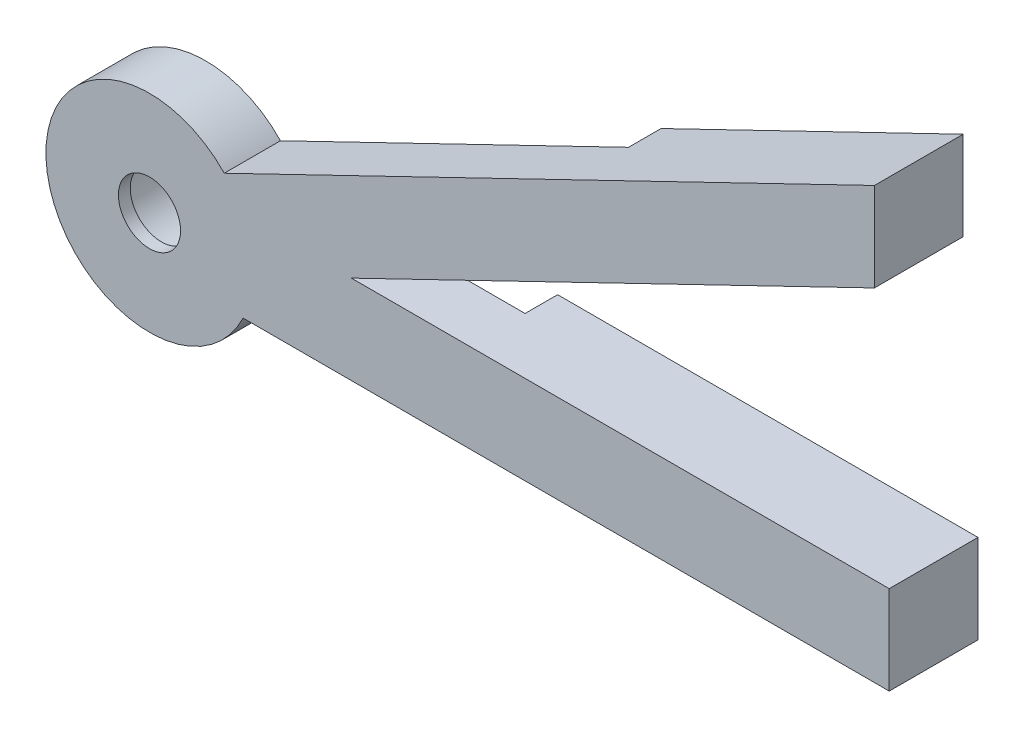
ISO-10303-21;
HEADER;
FILE_DESCRIPTION(('STEP AP214'),'2;1');
FILE_NAME('part.step','',(''),(''),'','','');
FILE_SCHEMA(('AUTOMOTIVE_DESIGN { 1 0 10303 214 1 1 1 1 }'));
ENDSEC;
DATA;
#1=APPLICATION_CONTEXT('core data for automotive mechanical design processes');
#2=APPLICATION_PROTOCOL_DEFINITION('international standard','automotive_design',2000,#1);
#3=PRODUCT_CONTEXT('',#1,'mechanical');
#4=PRODUCT('Part','Part','',(#3));
#5=PRODUCT_RELATED_PRODUCT_CATEGORY('part','',(#4));
#6=PRODUCT_DEFINITION_FORMATION('','',#4);
#7=PRODUCT_DEFINITION_CONTEXT('part definition',#1,'design');
#8=PRODUCT_DEFINITION('design','',#6,#7);
#9=PRODUCT_DEFINITION_SHAPE('','',#8);
#10=(LENGTH_UNIT() NAMED_UNIT(*) SI_UNIT(.MILLI.,.METRE.));
#11=(NAMED_UNIT(*) PLANE_ANGLE_UNIT() SI_UNIT($,.RADIAN.));
#12=(NAMED_UNIT(*) SI_UNIT($,.STERADIAN.) SOLID_ANGLE_UNIT());
#13=UNCERTAINTY_MEASURE_WITH_UNIT(LENGTH_MEASURE(1.E-05),#10,'distance_accuracy_value','');
#14=(GEOMETRIC_REPRESENTATION_CONTEXT(3) GLOBAL_UNCERTAINTY_ASSIGNED_CONTEXT((#13)) GLOBAL_UNIT_ASSIGNED_CONTEXT((#10,
#11,#12)) REPRESENTATION_CONTEXT('',''));
#15=CARTESIAN_POINT('',(0.,0.,0.));
#16=DIRECTION('',(0.,0.,1.));
#17=DIRECTION('',(1.,0.,0.));
#18=AXIS2_PLACEMENT_3D('',#15,#16,#17);
#19=CARTESIAN_POINT('',(-33.5242196667489,8.13237811094645,-3.8));
#20=DIRECTION('',(0.,0.,1.));
#21=DIRECTION('',(1.,0.,0.));
#22=AXIS2_PLACEMENT_3D('',#19,#20,#21);
#23=CYLINDRICAL_SURFACE('',#22,2.1);
#24=CARTESIAN_POINT('',(-33.5242196667489,8.13237811094645,0.));
#25=DIRECTION('',(0.,0.,1.));
#26=DIRECTION('',(1.,0.,0.));
#27=AXIS2_PLACEMENT_3D('',#24,#25,#26);
#28=CIRCLE('',#27,2.1);
#29=CARTESIAN_POINT('',(-31.4242196667489,8.13237811094645,0.));
#30=VERTEX_POINT('',#29);
#31=EDGE_CURVE('E227',#30,#30,#28,.T.);
#32=CARTESIAN_POINT('',(-33.5242196667489,8.13237811094645,-0.8));
#33=DIRECTION('',(0.,0.,-1.));
#34=DIRECTION('',(-1.,0.,0.));
#35=AXIS2_PLACEMENT_3D('',#32,#33,#34);
#36=CIRCLE('',#35,2.1);
#37=CARTESIAN_POINT('',(-31.4242196667489,8.13237811094645,-0.799999999999999));
#38=VERTEX_POINT('',#37);
#39=EDGE_CURVE('E44',#38,#38,#36,.F.);
#40=CARTESIAN_POINT('',(-31.4242196667489,8.13237811094645,0.));
#41=CARTESIAN_POINT('',(-31.4242196667489,8.13237811094645,-0.00833333333333328));
#42=CARTESIAN_POINT('',(-31.4242196667489,8.13237811094645,-0.0166666666666666));
#43=CARTESIAN_POINT('',(-31.4242196667489,8.13237811094645,-0.0333333333333333));
#44=CARTESIAN_POINT('',(-31.4242196667489,8.13237811094645,-0.0416666666666667));
#45=CARTESIAN_POINT('',(-31.4242196667489,8.13237811094645,-0.0583333333333334));
#46=CARTESIAN_POINT('',(-31.4242196667489,8.13237811094645,-0.0666666666666667));
#47=CARTESIAN_POINT('',(-31.4242196667489,8.13237811094645,-0.0833333333333333));
#48=CARTESIAN_POINT('',(-31.4242196667489,8.13237811094645,-0.0916666666666665));
#49=CARTESIAN_POINT('',(-31.4242196667489,8.13237811094645,-0.108333333333333));
#50=CARTESIAN_POINT('',(-31.4242196667489,8.13237811094645,-0.116666666666667));
#51=CARTESIAN_POINT('',(-31.4242196667489,8.13237811094645,-0.133333333333333));
#52=CARTESIAN_POINT('',(-31.4242196667489,8.13237811094645,-0.141666666666667));
#53=CARTESIAN_POINT('',(-31.4242196667489,8.13237811094645,-0.158333333333333));
#54=CARTESIAN_POINT('',(-31.4242196667489,8.13237811094645,-0.166666666666667));
#55=CARTESIAN_POINT('',(-31.4242196667489,8.13237811094645,-0.183333333333333));
#56=CARTESIAN_POINT('',(-31.4242196667489,8.13237811094645,-0.191666666666666));
#57=CARTESIAN_POINT('',(-31.4242196667489,8.13237811094645,-0.208333333333333));
#58=CARTESIAN_POINT('',(-31.4242196667489,8.13237811094645,-0.216666666666667));
#59=CARTESIAN_POINT('',(-31.4242196667489,8.13237811094645,-0.233333333333333));
#60=CARTESIAN_POINT('',(-31.4242196667489,8.13237811094645,-0.241666666666667));
#61=CARTESIAN_POINT('',(-31.4242196667489,8.13237811094645,-0.258333333333333));
#62=CARTESIAN_POINT('',(-31.4242196667489,8.13237811094645,-0.266666666666667));
#63=CARTESIAN_POINT('',(-31.4242196667489,8.13237811094645,-0.283333333333333));
#64=CARTESIAN_POINT('',(-31.4242196667489,8.13237811094645,-0.291666666666667));
#65=CARTESIAN_POINT('',(-31.4242196667489,8.13237811094645,-0.308333333333333));
#66=CARTESIAN_POINT('',(-31.4242196667489,8.13237811094645,-0.316666666666666));
#67=CARTESIAN_POINT('',(-31.4242196667489,8.13237811094645,-0.333333333333333));
#68=CARTESIAN_POINT('',(-31.4242196667489,8.13237811094645,-0.341666666666666));
#69=CARTESIAN_POINT('',(-31.4242196667489,8.13237811094645,-0.358333333333333));
#70=CARTESIAN_POINT('',(-31.4242196667489,8.13237811094645,-0.366666666666666));
#71=CARTESIAN_POINT('',(-31.4242196667489,8.13237811094645,-0.383333333333333));
#72=CARTESIAN_POINT('',(-31.4242196667489,8.13237811094645,-0.391666666666666));
#73=CARTESIAN_POINT('',(-31.4242196667489,8.13237811094645,-0.408333333333333));
#74=CARTESIAN_POINT('',(-31.4242196667489,8.13237811094645,-0.416666666666666));
#75=CARTESIAN_POINT('',(-31.4242196667489,8.13237811094645,-0.433333333333333));
#76=CARTESIAN_POINT('',(-31.4242196667489,8.13237811094645,-0.441666666666666));
#77=CARTESIAN_POINT('',(-31.4242196667489,8.13237811094645,-0.458333333333333));
#78=CARTESIAN_POINT('',(-31.4242196667489,8.13237811094645,-0.466666666666666));
#79=CARTESIAN_POINT('',(-31.4242196667489,8.13237811094645,-0.483333333333333));
#80=CARTESIAN_POINT('',(-31.4242196667489,8.13237811094645,-0.491666666666666));
#81=CARTESIAN_POINT('',(-31.4242196667489,8.13237811094645,-0.508333333333333));
#82=CARTESIAN_POINT('',(-31.4242196667489,8.13237811094645,-0.516666666666666));
#83=CARTESIAN_POINT('',(-31.4242196667489,8.13237811094645,-0.533333333333333));
#84=CARTESIAN_POINT('',(-31.4242196667489,8.13237811094645,-0.541666666666666));
#85=CARTESIAN_POINT('',(-31.4242196667489,8.13237811094645,-0.558333333333333));
#86=CARTESIAN_POINT('',(-31.4242196667489,8.13237811094645,-0.566666666666666));
#87=CARTESIAN_POINT('',(-31.4242196667489,8.13237811094645,-0.583333333333333));
#88=CARTESIAN_POINT('',(-31.4242196667489,8.13237811094645,-0.591666666666666));
#89=CARTESIAN_POINT('',(-31.4242196667489,8.13237811094645,-0.608333333333333));
#90=CARTESIAN_POINT('',(-31.4242196667489,8.13237811094645,-0.616666666666666));
#91=CARTESIAN_POINT('',(-31.4242196667489,8.13237811094645,-0.633333333333333));
#92=CARTESIAN_POINT('',(-31.4242196667489,8.13237811094645,-0.641666666666666));
#93=CARTESIAN_POINT('',(-31.4242196667489,8.13237811094645,-0.658333333333333));
#94=CARTESIAN_POINT('',(-31.4242196667489,8.13237811094645,-0.666666666666666));
#95=CARTESIAN_POINT('',(-31.4242196667489,8.13237811094645,-0.683333333333333));
#96=CARTESIAN_POINT('',(-31.4242196667489,8.13237811094645,-0.691666666666666));
#97=CARTESIAN_POINT('',(-31.4242196667489,8.13237811094645,-0.708333333333333));
#98=CARTESIAN_POINT('',(-31.4242196667489,8.13237811094645,-0.716666666666666));
#99=CARTESIAN_POINT('',(-31.4242196667489,8.13237811094645,-0.733333333333333));
#100=CARTESIAN_POINT('',(-31.4242196667489,8.13237811094645,-0.741666666666666));
#101=CARTESIAN_POINT('',(-31.4242196667489,8.13237811094645,-0.758333333333333));
#102=CARTESIAN_POINT('',(-31.4242196667489,8.13237811094645,-0.766666666666666));
#103=CARTESIAN_POINT('',(-31.4242196667489,8.13237811094645,-0.783333333333333));
#104=CARTESIAN_POINT('',(-31.4242196667489,8.13237811094645,-0.791666666666666));
#105=CARTESIAN_POINT('',(-31.4242196667489,8.13237811094645,-0.799999999999999));
#106=B_SPLINE_CURVE_WITH_KNOTS('',3,(#40,#41,#42,#43,#44,#45,#46,#47,#48,#49,#50,#51,#52,#53,
#54,#55,#56,#57,#58,#59,#60,#61,#62,#63,#64,#65,#66,#67,#68,#69,#70,#71,#72,#73,#74,#75,#76,#77,
#78,#79,#80,#81,#82,#83,#84,#85,#86,#87,#88,#89,#90,#91,#92,#93,#94,#95,#96,#97,#98,#99,#100,
#101,#102,#103,#104,#105),.UNSPECIFIED.,.F.,.F.,(4,2,2,2,2,2,2,2,2,2,2,2,2,2,2,2,2,2,2,2,2,2,2,
2,2,2,2,2,2,2,2,2,4),(0.,0.0249999999999998,0.0500000000000001,0.075,0.0999999999999998,0.125,
0.15,0.175,0.2,0.225,0.25,0.275,0.3,0.325,0.35,0.375,0.4,0.425,0.45,0.475,0.5,0.524999999999999,
0.55,0.575,0.6,0.625,0.65,0.674999999999999,0.7,0.725,0.75,0.775,0.799999999999999),.UNSPECIFIED.);
#107=EDGE_CURVE('BSEAM40',#30,#38,#106,.T.);
#108=ORIENTED_EDGE('',*,*,#31,.T.);
#109=ORIENTED_EDGE('',*,*,#39,.F.);
#110=ORIENTED_EDGE('',*,*,#107,.T.);
#111=ORIENTED_EDGE('',*,*,#107,.F.);
#112=EDGE_LOOP('',(#108,#110,#109,#111));
#113=FACE_BOUND('',#112,.T.);
#114=ADVANCED_FACE('F40',(#113),#23,.F.);
#115=CARTESIAN_POINT('',(-13.9298498562349,7.36520796996301,-6.));
#116=DIRECTION('',(-0.884034960308711,0.467420783611487,0.));
#117=DIRECTION('',(-0.467420783611487,-0.884034960308711,0.));
#118=AXIS2_PLACEMENT_3D('',#115,#116,#117);
#119=PLANE('',#118);
#120=DIRECTION('',(0.,0.,1.));
#121=VECTOR('',#120,1.);
#122=CARTESIAN_POINT('',(-9.20977335916853,16.2923091709366,-6.));
#123=LINE('',#122,#121);
#124=CARTESIAN_POINT('',(-9.20977335916853,16.2923091709366,-6.));
#125=VERTEX_POINT('',#124);
#126=CARTESIAN_POINT('',(-9.20977335916853,16.2923091709366,-3.8));
#127=VERTEX_POINT('',#126);
#128=EDGE_CURVE('E112',#125,#127,#123,.T.);
#129=ORIENTED_EDGE('',*,*,#128,.T.);
#130=DIRECTION('',(-0.467420783611487,-0.884034960308711,0.));
#131=VECTOR('',#130,1.);
#132=CARTESIAN_POINT('',(-13.9298498562349,7.36520796996301,-3.8));
#133=LINE('',#132,#131);
#134=CARTESIAN_POINT('',(-4.94725282669385,24.3540327867042,-3.8));
#135=VERTEX_POINT('',#134);
#136=EDGE_CURVE('E250',#135,#127,#133,.T.);
#137=ORIENTED_EDGE('',*,*,#136,.F.);
#138=DIRECTION('',(0.,0.,1.));
#139=VECTOR('',#138,1.);
#140=CARTESIAN_POINT('',(-4.94725282669385,24.3540327867042,-6.));
#141=LINE('',#140,#139);
#142=CARTESIAN_POINT('',(-4.94725282669385,24.3540327867042,-6.));
#143=VERTEX_POINT('',#142);
#144=EDGE_CURVE('E121',#143,#135,#141,.T.);
#145=ORIENTED_EDGE('',*,*,#144,.F.);
#146=DIRECTION('',(-0.467420783611487,-0.884034960308711,0.));
#147=VECTOR('',#146,1.);
#148=CARTESIAN_POINT('',(-13.9298498562349,7.36520796996301,-6.));
#149=LINE('',#148,#147);
#150=EDGE_CURVE('E105',#143,#125,#149,.T.);
#151=ORIENTED_EDGE('',*,*,#150,.T.);
#152=EDGE_LOOP('',(#129,#137,#145,#151));
#153=FACE_BOUND('',#152,.T.);
#154=ADVANCED_FACE('F123',(#153),#119,.T.);
#155=CARTESIAN_POINT('',(-10.4843081302131,21.6758339149091,-6.));
#156=DIRECTION('',(-0.435426361400698,0.900224351924202,0.));
#157=DIRECTION('',(-0.900224351924202,-0.435426361400698,0.));
#158=AXIS2_PLACEMENT_3D('',#155,#156,#157);
#159=PLANE('',#158);
#160=DIRECTION('',(-0.900224351924202,-0.435426361400698,0.));
#161=VECTOR('',#160,1.);
#162=CARTESIAN_POINT('',(-10.4843081302131,21.6758339149091,0.));
#163=LINE('',#162,#161);
#164=CARTESIAN_POINT('',(15.4757803332508,34.2323781109476,0.));
#165=VERTEX_POINT('',#164);
#166=CARTESIAN_POINT('',(-28.4706531060429,12.9760817575906,0.));
#167=VERTEX_POINT('',#166);
#168=EDGE_CURVE('E135',#165,#167,#163,.T.);
#169=ORIENTED_EDGE('',*,*,#168,.F.);
#170=DIRECTION('',(0.,0.,1.));
#171=VECTOR('',#170,1.);
#172=CARTESIAN_POINT('',(15.4757803332508,34.2323781109476,-6.));
#173=LINE('',#172,#171);
#174=CARTESIAN_POINT('',(15.4757803332508,34.2323781109476,-6.));
#175=VERTEX_POINT('',#174);
#176=EDGE_CURVE('E11',#175,#165,#173,.T.);
#177=ORIENTED_EDGE('',*,*,#176,.F.);
#178=DIRECTION('',(-0.900224351924202,-0.435426361400698,0.));
#179=VECTOR('',#178,1.);
#180=CARTESIAN_POINT('',(-10.4843081302131,21.6758339149091,-6.));
#181=LINE('',#180,#179);
#182=EDGE_CURVE('E126',#175,#143,#181,.T.);
#183=ORIENTED_EDGE('',*,*,#182,.T.);
#184=ORIENTED_EDGE('',*,*,#144,.T.);
#185=DIRECTION('',(-0.900224351924202,-0.435426361400698,0.));
#186=VECTOR('',#185,1.);
#187=CARTESIAN_POINT('',(-10.4843081302131,21.6758339149091,-3.8));
#188=LINE('',#187,#186);
#189=CARTESIAN_POINT('',(-28.4706531060429,12.9760817575906,-3.8));
#190=VERTEX_POINT('',#189);
#191=EDGE_CURVE('E151',#135,#190,#188,.T.);
#192=ORIENTED_EDGE('',*,*,#191,.T.);
#193=DIRECTION('',(0.,0.,1.));
#194=VECTOR('',#193,1.);
#195=CARTESIAN_POINT('',(-28.4706531060429,12.9760817575906,-3.8));
#196=LINE('',#195,#194);
#197=EDGE_CURVE('E278',#190,#167,#196,.T.);
#198=ORIENTED_EDGE('',*,*,#197,.T.);
#199=EDGE_LOOP('',(#169,#177,#183,#184,#192,#198));
#200=FACE_BOUND('',#199,.T.);
#201=ADVANCED_FACE('F42',(#200),#159,.T.);
#202=CARTESIAN_POINT('',(15.4757803332508,0.,-6.));
#203=DIRECTION('',(1.,0.,0.));
#204=DIRECTION('',(0.,0.,-1.));
#205=AXIS2_PLACEMENT_3D('',#202,#203,#204);
#206=PLANE('',#205);
#207=DIRECTION('',(0.,1.,0.));
#208=VECTOR('',#207,1.);
#209=CARTESIAN_POINT('',(15.4757803332508,0.,0.));
#210=LINE('',#209,#208);
#211=CARTESIAN_POINT('',(15.4757803332508,28.2323781109476,0.));
#212=VERTEX_POINT('',#211);
#213=EDGE_CURVE('E129',#212,#165,#210,.T.);
#214=ORIENTED_EDGE('',*,*,#213,.F.);
#215=DIRECTION('',(0.,0.,1.));
#216=VECTOR('',#215,1.);
#217=CARTESIAN_POINT('',(15.4757803332508,28.2323781109476,-6.));
#218=LINE('',#217,#216);
#219=CARTESIAN_POINT('',(15.4757803332508,28.2323781109476,-6.));
#220=VERTEX_POINT('',#219);
#221=EDGE_CURVE('E51',#220,#212,#218,.T.);
#222=ORIENTED_EDGE('',*,*,#221,.F.);
#223=DIRECTION('',(0.,1.,0.));
#224=VECTOR('',#223,1.);
#225=CARTESIAN_POINT('',(15.4757803332508,0.,-6.));
#226=LINE('',#225,#224);
#227=EDGE_CURVE('E107',#220,#175,#226,.T.);
#228=ORIENTED_EDGE('',*,*,#227,.T.);
#229=ORIENTED_EDGE('',*,*,#176,.T.);
#230=EDGE_LOOP('',(#214,#222,#228,#229));
#231=FACE_BOUND('',#230,.T.);
#232=ADVANCED_FACE('F303',(#231),#206,.T.);
#233=CARTESIAN_POINT('',(-8.13241964619716,16.813410612125,-6.));
#234=DIRECTION('',(-0.435426361400698,0.900224351924202,0.));
#235=DIRECTION('',(-0.900224351924202,-0.435426361400698,0.));
#236=AXIS2_PLACEMENT_3D('',#233,#234,#235);
#237=PLANE('',#236);
#238=DIRECTION('',(-0.900224351924202,-0.435426361400698,0.));
#239=VECTOR('',#238,1.);
#240=CARTESIAN_POINT('',(-8.13241964619716,16.813410612125,0.));
#241=LINE('',#240,#239);
#242=CARTESIAN_POINT('',(-19.8776979641709,11.1323781109464,0.));
#243=VERTEX_POINT('',#242);
#244=EDGE_CURVE('E138',#212,#243,#241,.T.);
#245=ORIENTED_EDGE('',*,*,#244,.T.);
#246=DIRECTION('',(0.,0.,1.));
#247=VECTOR('',#246,1.);
#248=CARTESIAN_POINT('',(-19.8776979641709,11.1323781109464,-3.8));
#249=LINE('',#248,#247);
#250=CARTESIAN_POINT('',(-19.8776979641709,11.1323781109464,-3.8));
#251=VERTEX_POINT('',#250);
#252=EDGE_CURVE('E263',#251,#243,#249,.T.);
#253=ORIENTED_EDGE('',*,*,#252,.F.);
#254=DIRECTION('',(-0.900224351924202,-0.435426361400698,0.));
#255=VECTOR('',#254,1.);
#256=CARTESIAN_POINT('',(-8.13241964619716,16.813410612125,-3.8));
#257=LINE('',#256,#255);
#258=EDGE_CURVE('E117',#127,#251,#257,.T.);
#259=ORIENTED_EDGE('',*,*,#258,.F.);
#260=ORIENTED_EDGE('',*,*,#128,.F.);
#261=DIRECTION('',(-0.900224351924202,-0.435426361400698,0.));
#262=VECTOR('',#261,1.);
#263=CARTESIAN_POINT('',(-8.13241964619716,16.813410612125,-6.));
#264=LINE('',#263,#262);
#265=EDGE_CURVE('E101',#220,#125,#264,.T.);
#266=ORIENTED_EDGE('',*,*,#265,.F.);
#267=ORIENTED_EDGE('',*,*,#221,.T.);
#268=EDGE_LOOP('',(#245,#253,#259,#260,#266,#267));
#269=FACE_BOUND('',#268,.T.);
#270=ADVANCED_FACE('F113',(#269),#237,.F.);
#271=CARTESIAN_POINT('',(0.,0.,-6.));
#272=DIRECTION('',(0.,0.,1.));
#273=DIRECTION('',(1.,0.,0.));
#274=AXIS2_PLACEMENT_3D('',#271,#272,#273);
#275=PLANE('',#274);
#276=ORIENTED_EDGE('',*,*,#182,.F.);
#277=ORIENTED_EDGE('',*,*,#227,.F.);
#278=ORIENTED_EDGE('',*,*,#265,.T.);
#279=ORIENTED_EDGE('',*,*,#150,.F.);
#280=EDGE_LOOP('',(#276,#277,#278,#279));
#281=FACE_BOUND('',#280,.T.);
#282=ADVANCED_FACE('F103',(#281),#275,.F.);
#283=CARTESIAN_POINT('',(0.,0.,0.));
#284=DIRECTION('',(0.,0.,1.));
#285=DIRECTION('',(1.,0.,0.));
#286=AXIS2_PLACEMENT_3D('',#283,#284,#285);
#287=PLANE('',#286);
#288=DIRECTION('',(1.,0.,0.));
#289=VECTOR('',#288,1.);
#290=CARTESIAN_POINT('',(0.,5.13237811094646,0.));
#291=LINE('',#290,#289);
#292=CARTESIAN_POINT('',(-27.1996643464122,5.13237811094649,0.));
#293=VERTEX_POINT('',#292);
#294=CARTESIAN_POINT('',(16.4757803332508,5.13237811094645,0.));
#295=VERTEX_POINT('',#294);
#296=EDGE_CURVE('E241',#293,#295,#291,.T.);
#297=ORIENTED_EDGE('',*,*,#296,.T.);
#298=DIRECTION('',(0.,1.,0.));
#299=VECTOR('',#298,1.);
#300=CARTESIAN_POINT('',(16.4757803332508,0.,0.));
#301=LINE('',#300,#299);
#302=CARTESIAN_POINT('',(16.4757803332508,11.1323781109464,0.));
#303=VERTEX_POINT('',#302);
#304=EDGE_CURVE('E203',#295,#303,#301,.T.);
#305=ORIENTED_EDGE('',*,*,#304,.T.);
#306=DIRECTION('',(1.,0.,0.));
#307=VECTOR('',#306,1.);
#308=CARTESIAN_POINT('',(0.,11.1323781109464,0.));
#309=LINE('',#308,#307);
#310=EDGE_CURVE('E267',#243,#303,#309,.T.);
#311=ORIENTED_EDGE('',*,*,#310,.F.);
#312=ORIENTED_EDGE('',*,*,#244,.F.);
#313=ORIENTED_EDGE('',*,*,#213,.T.);
#314=ORIENTED_EDGE('',*,*,#168,.T.);
#315=CARTESIAN_POINT('',(-33.5242196667489,8.13237811094645,0.));
#316=DIRECTION('',(0.,0.,1.));
#317=DIRECTION('',(1.,0.,0.));
#318=AXIS2_PLACEMENT_3D('',#315,#316,#317);
#319=CIRCLE('',#318,6.99999999999997);
#320=EDGE_CURVE('E270',#167,#293,#319,.T.);
#321=ORIENTED_EDGE('',*,*,#320,.T.);
#322=EDGE_LOOP('',(#297,#305,#311,#312,#313,#314,#321));
#323=FACE_BOUND('',#322,.T.);
#324=ORIENTED_EDGE('',*,*,#31,.F.);
#325=EDGE_LOOP('',(#324));
#326=FACE_BOUND('',#325,.T.);
#327=ADVANCED_FACE('F288',(#323,#326),#287,.T.);
#328=CARTESIAN_POINT('',(0.,5.13237811094646,-3.8));
#329=DIRECTION('',(0.,-1.,0.));
#330=DIRECTION('',(1.,0.,0.));
#331=AXIS2_PLACEMENT_3D('',#328,#329,#330);
#332=PLANE('',#331);
#333=ORIENTED_EDGE('',*,*,#296,.F.);
#334=DIRECTION('',(0.,0.,1.));
#335=VECTOR('',#334,1.);
#336=CARTESIAN_POINT('',(-27.1996643464122,5.13237811094649,-3.8));
#337=LINE('',#336,#335);
#338=CARTESIAN_POINT('',(-27.1996643464122,5.13237811094649,-3.8));
#339=VERTEX_POINT('',#338);
#340=EDGE_CURVE('E139',#339,#293,#337,.T.);
#341=ORIENTED_EDGE('',*,*,#340,.F.);
#342=DIRECTION('',(1.,0.,0.));
#343=VECTOR('',#342,1.);
#344=CARTESIAN_POINT('',(0.,5.13237811094646,-3.8));
#345=LINE('',#344,#343);
#346=CARTESIAN_POINT('',(-13.7504997334641,5.13237811094647,-3.8));
#347=VERTEX_POINT('',#346);
#348=EDGE_CURVE('E259',#339,#347,#345,.T.);
#349=ORIENTED_EDGE('',*,*,#348,.T.);
#350=DIRECTION('',(0.,0.,1.));
#351=VECTOR('',#350,1.);
#352=CARTESIAN_POINT('',(-13.7504997334641,5.13237811094647,-6.));
#353=LINE('',#352,#351);
#354=CARTESIAN_POINT('',(-13.7504997334641,5.13237811094647,-6.));
#355=VERTEX_POINT('',#354);
#356=EDGE_CURVE('E79',#355,#347,#353,.T.);
#357=ORIENTED_EDGE('',*,*,#356,.F.);
#358=DIRECTION('',(1.,0.,0.));
#359=VECTOR('',#358,1.);
#360=CARTESIAN_POINT('',(0.,5.13237811094646,-6.));
#361=LINE('',#360,#359);
#362=CARTESIAN_POINT('',(16.4757803332508,5.13237811094645,-6.));
#363=VERTEX_POINT('',#362);
#364=EDGE_CURVE('E209',#355,#363,#361,.T.);
#365=ORIENTED_EDGE('',*,*,#364,.T.);
#366=DIRECTION('',(0.,0.,1.));
#367=VECTOR('',#366,1.);
#368=CARTESIAN_POINT('',(16.4757803332508,5.13237811094645,-6.));
#369=LINE('',#368,#367);
#370=EDGE_CURVE('E232',#363,#295,#369,.T.);
#371=ORIENTED_EDGE('',*,*,#370,.T.);
#372=EDGE_LOOP('',(#333,#341,#349,#357,#365,#371));
#373=FACE_BOUND('',#372,.T.);
#374=ADVANCED_FACE('F296',(#373),#332,.T.);
#375=CARTESIAN_POINT('',(-33.5242196667489,8.13237811094645,-3.8));
#376=DIRECTION('',(0.,0.,1.));
#377=DIRECTION('',(1.,0.,0.));
#378=AXIS2_PLACEMENT_3D('',#375,#376,#377);
#379=CYLINDRICAL_SURFACE('',#378,6.99999999999997);
#380=ORIENTED_EDGE('',*,*,#320,.F.);
#381=ORIENTED_EDGE('',*,*,#197,.F.);
#382=CARTESIAN_POINT('',(-33.5242196667489,8.13237811094645,-3.8));
#383=DIRECTION('',(0.,0.,1.));
#384=DIRECTION('',(1.,0.,0.));
#385=AXIS2_PLACEMENT_3D('',#382,#383,#384);
#386=CIRCLE('',#385,6.99999999999997);
#387=EDGE_CURVE('E255',#190,#339,#386,.T.);
#388=ORIENTED_EDGE('',*,*,#387,.T.);
#389=ORIENTED_EDGE('',*,*,#340,.T.);
#390=EDGE_LOOP('',(#380,#381,#388,#389));
#391=FACE_BOUND('',#390,.T.);
#392=ADVANCED_FACE('F301',(#391),#379,.T.);
#393=CARTESIAN_POINT('',(0.,11.1323781109464,-3.8));
#394=DIRECTION('',(0.,-1.,0.));
#395=DIRECTION('',(0.,0.,-1.));
#396=AXIS2_PLACEMENT_3D('',#393,#394,#395);
#397=PLANE('',#396);
#398=ORIENTED_EDGE('',*,*,#310,.T.);
#399=DIRECTION('',(0.,0.,1.));
#400=VECTOR('',#399,1.);
#401=CARTESIAN_POINT('',(16.4757803332508,11.1323781109464,-6.));
#402=LINE('',#401,#400);
#403=CARTESIAN_POINT('',(16.4757803332508,11.1323781109464,-6.));
#404=VERTEX_POINT('',#403);
#405=EDGE_CURVE('E228',#404,#303,#402,.T.);
#406=ORIENTED_EDGE('',*,*,#405,.F.);
#407=DIRECTION('',(1.,0.,0.));
#408=VECTOR('',#407,1.);
#409=CARTESIAN_POINT('',(0.,11.1323781109464,-6.));
#410=LINE('',#409,#408);
#411=CARTESIAN_POINT('',(-11.9380127701977,11.1323781109464,-6.));
#412=VERTEX_POINT('',#411);
#413=EDGE_CURVE('E193',#412,#404,#410,.T.);
#414=ORIENTED_EDGE('',*,*,#413,.F.);
#415=DIRECTION('',(0.,0.,1.));
#416=VECTOR('',#415,1.);
#417=CARTESIAN_POINT('',(-11.9380127701977,11.1323781109464,-6.));
#418=LINE('',#417,#416);
#419=CARTESIAN_POINT('',(-11.9380127701977,11.1323781109464,-3.8));
#420=VERTEX_POINT('',#419);
#421=EDGE_CURVE('E200',#412,#420,#418,.T.);
#422=ORIENTED_EDGE('',*,*,#421,.T.);
#423=DIRECTION('',(1.,0.,0.));
#424=VECTOR('',#423,1.);
#425=CARTESIAN_POINT('',(0.,11.1323781109464,-3.8));
#426=LINE('',#425,#424);
#427=EDGE_CURVE('E244',#251,#420,#426,.T.);
#428=ORIENTED_EDGE('',*,*,#427,.F.);
#429=ORIENTED_EDGE('',*,*,#252,.T.);
#430=EDGE_LOOP('',(#398,#406,#414,#422,#428,#429));
#431=FACE_BOUND('',#430,.T.);
#432=ADVANCED_FACE('F285',(#431),#397,.F.);
#433=CARTESIAN_POINT('',(0.,0.,-3.8));
#434=DIRECTION('',(0.,0.,1.));
#435=DIRECTION('',(1.,0.,0.));
#436=AXIS2_PLACEMENT_3D('',#433,#434,#435);
#437=PLANE('',#436);
#438=CARTESIAN_POINT('',(-33.5242196667489,8.13237811094645,-3.8));
#439=DIRECTION('',(0.,0.,-1.));
#440=DIRECTION('',(-1.,0.,0.));
#441=AXIS2_PLACEMENT_3D('',#438,#439,#440);
#442=CIRCLE('',#441,3.1);
#443=CARTESIAN_POINT('',(-36.6242196667489,8.13237811094645,-3.8));
#444=VERTEX_POINT('',#443);
#445=EDGE_CURVE('E362',#444,#444,#442,.T.);
#446=ORIENTED_EDGE('',*,*,#445,.F.);
#447=EDGE_LOOP('',(#446));
#448=FACE_BOUND('',#447,.T.);
#449=CARTESIAN_POINT('',(-33.5242196667489,8.13237811094645,-3.8));
#450=DIRECTION('',(0.,0.,1.));
#451=DIRECTION('',(1.,0.,0.));
#452=AXIS2_PLACEMENT_3D('',#449,#450,#451);
#453=CIRCLE('',#452,19.9999999999997);
#454=CARTESIAN_POINT('',(-13.5242196667492,8.13237811094669,-3.8));
#455=VERTEX_POINT('',#454);
#456=EDGE_CURVE('E189',#455,#347,#453,.F.);
#457=ORIENTED_EDGE('',*,*,#456,.T.);
#458=ORIENTED_EDGE('',*,*,#348,.F.);
#459=ORIENTED_EDGE('',*,*,#387,.F.);
#460=ORIENTED_EDGE('',*,*,#191,.F.);
#461=ORIENTED_EDGE('',*,*,#136,.T.);
#462=ORIENTED_EDGE('',*,*,#258,.T.);
#463=ORIENTED_EDGE('',*,*,#427,.T.);
#464=DIRECTION('',(0.467420783611487,0.884034960308711,0.));
#465=VECTOR('',#464,1.);
#466=CARTESIAN_POINT('',(-13.9298498562349,7.36520796996301,-3.8));
#467=LINE('',#466,#465);
#468=EDGE_CURVE('E240',#455,#420,#467,.T.);
#469=ORIENTED_EDGE('',*,*,#468,.F.);
#470=EDGE_LOOP('',(#457,#458,#459,#460,#461,#462,#463,#469));
#471=FACE_BOUND('',#470,.T.);
#472=ADVANCED_FACE('F298',(#448,#471),#437,.F.);
#473=CARTESIAN_POINT('',(-13.9298498562349,7.36520796996301,-6.));
#474=DIRECTION('',(0.884034960308711,-0.467420783611486,0.));
#475=DIRECTION('',(0.467420783611487,0.884034960308711,0.));
#476=AXIS2_PLACEMENT_3D('',#473,#474,#475);
#477=PLANE('',#476);
#478=DIRECTION('',(0.,0.,1.));
#479=VECTOR('',#478,1.);
#480=CARTESIAN_POINT('',(-13.5242196667492,8.13237811094669,-6.));
#481=LINE('',#480,#479);
#482=CARTESIAN_POINT('',(-13.5242196667492,8.13237811094669,-6.));
#483=VERTEX_POINT('',#482);
#484=EDGE_CURVE('E184',#483,#455,#481,.T.);
#485=ORIENTED_EDGE('',*,*,#484,.T.);
#486=ORIENTED_EDGE('',*,*,#468,.T.);
#487=ORIENTED_EDGE('',*,*,#421,.F.);
#488=DIRECTION('',(0.467420783611487,0.884034960308711,0.));
#489=VECTOR('',#488,1.);
#490=CARTESIAN_POINT('',(-13.9298498562349,7.36520796996301,-6.));
#491=LINE('',#490,#489);
#492=EDGE_CURVE('E197',#483,#412,#491,.T.);
#493=ORIENTED_EDGE('',*,*,#492,.F.);
#494=EDGE_LOOP('',(#485,#486,#487,#493));
#495=FACE_BOUND('',#494,.T.);
#496=ADVANCED_FACE('F198',(#495),#477,.F.);
#497=CARTESIAN_POINT('',(-33.5242196667489,8.13237811094645,-6.));
#498=DIRECTION('',(0.,0.,1.));
#499=DIRECTION('',(1.,0.,0.));
#500=AXIS2_PLACEMENT_3D('',#497,#498,#499);
#501=CYLINDRICAL_SURFACE('',#500,19.9999999999997);
#502=ORIENTED_EDGE('',*,*,#456,.F.);
#503=ORIENTED_EDGE('',*,*,#484,.F.);
#504=CARTESIAN_POINT('',(-33.5242196667489,8.13237811094645,-6.));
#505=DIRECTION('',(0.,0.,1.));
#506=DIRECTION('',(1.,0.,0.));
#507=AXIS2_PLACEMENT_3D('',#504,#505,#506);
#508=CIRCLE('',#507,19.9999999999997);
#509=EDGE_CURVE('E188',#483,#355,#508,.F.);
#510=ORIENTED_EDGE('',*,*,#509,.T.);
#511=ORIENTED_EDGE('',*,*,#356,.T.);
#512=EDGE_LOOP('',(#502,#503,#510,#511));
#513=FACE_BOUND('',#512,.T.);
#514=ADVANCED_FACE('F186',(#513),#501,.F.);
#515=CARTESIAN_POINT('',(16.4757803332508,0.,-6.));
#516=DIRECTION('',(1.,0.,0.));
#517=DIRECTION('',(0.,0.,-1.));
#518=AXIS2_PLACEMENT_3D('',#515,#516,#517);
#519=PLANE('',#518);
#520=ORIENTED_EDGE('',*,*,#304,.F.);
#521=ORIENTED_EDGE('',*,*,#370,.F.);
#522=DIRECTION('',(0.,1.,0.));
#523=VECTOR('',#522,1.);
#524=CARTESIAN_POINT('',(16.4757803332508,0.,-6.));
#525=LINE('',#524,#523);
#526=EDGE_CURVE('E213',#363,#404,#525,.T.);
#527=ORIENTED_EDGE('',*,*,#526,.T.);
#528=ORIENTED_EDGE('',*,*,#405,.T.);
#529=EDGE_LOOP('',(#520,#521,#527,#528));
#530=FACE_BOUND('',#529,.T.);
#531=ADVANCED_FACE('F294',(#530),#519,.T.);
#532=CARTESIAN_POINT('',(0.,0.,-6.));
#533=DIRECTION('',(0.,0.,1.));
#534=DIRECTION('',(1.,0.,0.));
#535=AXIS2_PLACEMENT_3D('',#532,#533,#534);
#536=PLANE('',#535);
#537=ORIENTED_EDGE('',*,*,#492,.T.);
#538=ORIENTED_EDGE('',*,*,#413,.T.);
#539=ORIENTED_EDGE('',*,*,#526,.F.);
#540=ORIENTED_EDGE('',*,*,#364,.F.);
#541=ORIENTED_EDGE('',*,*,#509,.F.);
#542=EDGE_LOOP('',(#537,#538,#539,#540,#541));
#543=FACE_BOUND('',#542,.T.);
#544=ADVANCED_FACE('F206',(#543),#536,.F.);
#545=CARTESIAN_POINT('',(-33.5242196667489,8.13237811094645,-0.8));
#546=DIRECTION('',(0.,0.,-1.));
#547=DIRECTION('',(-1.,0.,0.));
#548=AXIS2_PLACEMENT_3D('',#545,#546,#547);
#549=PLANE('',#548);
#550=CARTESIAN_POINT('',(-33.5242196667489,8.13237811094645,-0.8));
#551=DIRECTION('',(0.,0.,-1.));
#552=DIRECTION('',(-1.,0.,0.));
#553=AXIS2_PLACEMENT_3D('',#550,#551,#552);
#554=CIRCLE('',#553,3.1);
#555=CARTESIAN_POINT('',(-36.6242196667489,8.13237811094645,-0.8));
#556=VERTEX_POINT('',#555);
#557=EDGE_CURVE('E357',#556,#556,#554,.T.);
#558=ORIENTED_EDGE('',*,*,#557,.T.);
#559=EDGE_LOOP('',(#558));
#560=FACE_BOUND('',#559,.T.);
#561=ORIENTED_EDGE('',*,*,#39,.T.);
#562=EDGE_LOOP('',(#561));
#563=FACE_BOUND('',#562,.T.);
#564=ADVANCED_FACE('F344',(#560,#563),#549,.T.);
#565=CARTESIAN_POINT('',(-33.5242196667489,8.13237811094645,-0.8));
#566=DIRECTION('',(0.,0.,-1.));
#567=DIRECTION('',(-1.,0.,0.));
#568=AXIS2_PLACEMENT_3D('',#565,#566,#567);
#569=CYLINDRICAL_SURFACE('',#568,3.1);
#570=ORIENTED_EDGE('',*,*,#557,.F.);
#571=EDGE_LOOP('',(#570));
#572=FACE_BOUND('',#571,.T.);
#573=ORIENTED_EDGE('',*,*,#445,.T.);
#574=EDGE_LOOP('',(#573));
#575=FACE_BOUND('',#574,.T.);
#576=ADVANCED_FACE('F345',(#572,#575),#569,.F.);
#577=CLOSED_SHELL('',(#114,#154,#201,#232,#270,#282,#327,#374,#392,#432,#472,#496,#514,#531,
#544,#564,#576));
#578=MANIFOLD_SOLID_BREP('B2',#577);
#579=ADVANCED_BREP_SHAPE_REPRESENTATION('',(#18,#578),#14);
#580=SHAPE_DEFINITION_REPRESENTATION(#9,#579);
ENDSEC;
END-ISO-10303-21;
